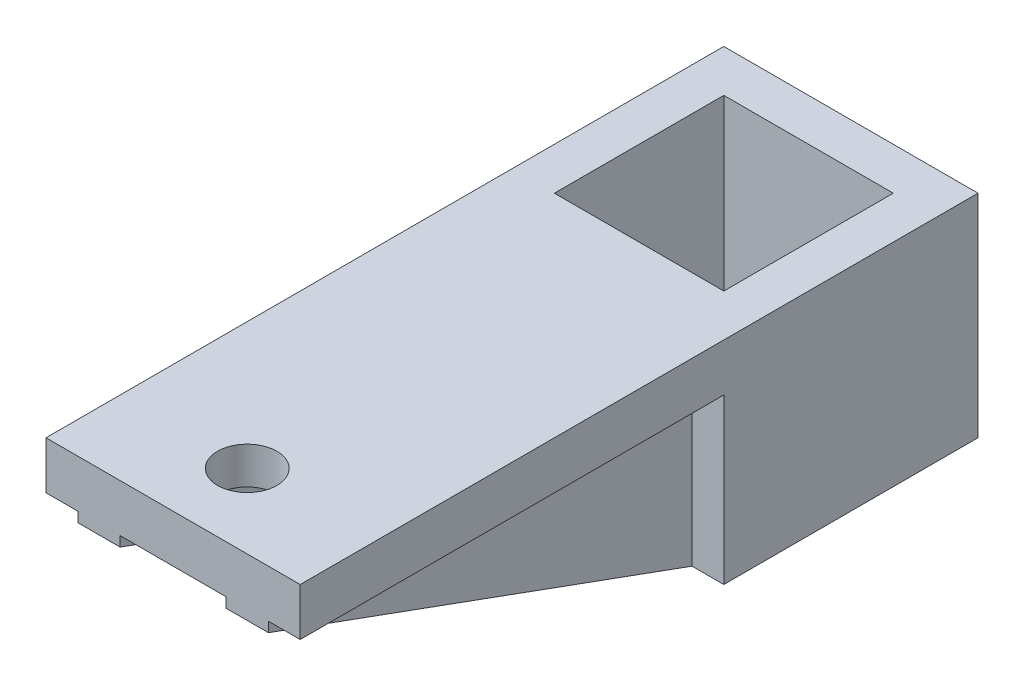
ISO-10303-21;
HEADER;
FILE_DESCRIPTION(('STEP AP214'),'2;1');
FILE_NAME('part.step','',(''),(''),'','','');
FILE_SCHEMA(('AUTOMOTIVE_DESIGN { 1 0 10303 214 1 1 1 1 }'));
ENDSEC;
DATA;
#1=APPLICATION_CONTEXT('core data for automotive mechanical design processes');
#2=APPLICATION_PROTOCOL_DEFINITION('international standard','automotive_design',2000,#1);
#3=PRODUCT_CONTEXT('',#1,'mechanical');
#4=PRODUCT('Part','Part','',(#3));
#5=PRODUCT_RELATED_PRODUCT_CATEGORY('part','',(#4));
#6=PRODUCT_DEFINITION_FORMATION('','',#4);
#7=PRODUCT_DEFINITION_CONTEXT('part definition',#1,'design');
#8=PRODUCT_DEFINITION('design','',#6,#7);
#9=PRODUCT_DEFINITION_SHAPE('','',#8);
#10=(LENGTH_UNIT() NAMED_UNIT(*) SI_UNIT(.MILLI.,.METRE.));
#11=(NAMED_UNIT(*) PLANE_ANGLE_UNIT() SI_UNIT($,.RADIAN.));
#12=(NAMED_UNIT(*) SI_UNIT($,.STERADIAN.) SOLID_ANGLE_UNIT());
#13=UNCERTAINTY_MEASURE_WITH_UNIT(LENGTH_MEASURE(1.E-05),#10,'distance_accuracy_value','');
#14=(GEOMETRIC_REPRESENTATION_CONTEXT(3) GLOBAL_UNCERTAINTY_ASSIGNED_CONTEXT((#13)) GLOBAL_UNIT_ASSIGNED_CONTEXT((#10,
#11,#12)) REPRESENTATION_CONTEXT('',''));
#15=CARTESIAN_POINT('',(0.,0.,0.));
#16=DIRECTION('',(0.,0.,1.));
#17=DIRECTION('',(1.,0.,0.));
#18=AXIS2_PLACEMENT_3D('',#15,#16,#17);
#19=CARTESIAN_POINT('',(-4.,15.5,44.));
#20=DIRECTION('',(0.,1.,0.));
#21=DIRECTION('',(0.,0.,1.));
#22=AXIS2_PLACEMENT_3D('',#19,#20,#21);
#23=PLANE('',#22);
#24=DIRECTION('',(0.,0.,-1.));
#25=VECTOR('',#24,1.);
#26=CARTESIAN_POINT('',(13.,15.5,43.9999999999996));
#27=LINE('',#26,#25);
#28=CARTESIAN_POINT('',(13.,15.5,37.));
#29=VERTEX_POINT('',#28);
#30=CARTESIAN_POINT('',(13.,15.5,4.));
#31=VERTEX_POINT('',#30);
#32=EDGE_CURVE('E180',#29,#31,#27,.T.);
#33=ORIENTED_EDGE('',*,*,#32,.F.);
#34=CARTESIAN_POINT('',(8.,15.5,37.));
#35=DIRECTION('',(0.,-1.,0.));
#36=DIRECTION('',(0.,0.,-1.));
#37=AXIS2_PLACEMENT_3D('',#34,#35,#36);
#38=CIRCLE('',#37,5.);
#39=CARTESIAN_POINT('',(3.,15.5,37.));
#40=VERTEX_POINT('',#39);
#41=EDGE_CURVE('E53',#40,#29,#38,.T.);
#42=ORIENTED_EDGE('',*,*,#41,.F.);
#43=DIRECTION('',(0.,0.,1.));
#44=VECTOR('',#43,1.);
#45=CARTESIAN_POINT('',(3.,15.5,43.9999999999996));
#46=LINE('',#45,#44);
#47=CARTESIAN_POINT('',(3.,15.5,4.));
#48=VERTEX_POINT('',#47);
#49=EDGE_CURVE('E178',#48,#40,#46,.T.);
#50=ORIENTED_EDGE('',*,*,#49,.F.);
#51=DIRECTION('',(1.,0.,0.));
#52=VECTOR('',#51,1.);
#53=CARTESIAN_POINT('',(-4.,15.5,4.));
#54=LINE('',#53,#52);
#55=EDGE_CURVE('E227',#48,#31,#54,.T.);
#56=ORIENTED_EDGE('',*,*,#55,.T.);
#57=EDGE_LOOP('',(#33,#42,#50,#56));
#58=FACE_BOUND('',#57,.T.);
#59=ADVANCED_FACE('F37',(#58),#23,.F.);
#60=CARTESIAN_POINT('',(8.,-24.5,37.));
#61=DIRECTION('',(0.,1.,0.));
#62=DIRECTION('',(0.,0.,1.));
#63=AXIS2_PLACEMENT_3D('',#60,#61,#62);
#64=CYLINDRICAL_SURFACE('',#63,2.8);
#65=CARTESIAN_POINT('',(8.,20.,37.));
#66=DIRECTION('',(0.,1.,0.));
#67=DIRECTION('',(0.,0.,1.));
#68=AXIS2_PLACEMENT_3D('',#65,#66,#67);
#69=CIRCLE('',#68,2.8);
#70=CARTESIAN_POINT('',(8.,20.,39.8));
#71=VERTEX_POINT('',#70);
#72=EDGE_CURVE('E206',#71,#71,#69,.F.);
#73=ORIENTED_EDGE('',*,*,#72,.F.);
#74=EDGE_LOOP('',(#73));
#75=FACE_BOUND('',#74,.T.);
#76=CARTESIAN_POINT('',(8.,16.5,37.));
#77=DIRECTION('',(0.,-1.,0.));
#78=DIRECTION('',(0.,0.,-1.));
#79=AXIS2_PLACEMENT_3D('',#76,#77,#78);
#80=CIRCLE('',#79,2.8);
#81=CARTESIAN_POINT('',(8.,16.5,34.2));
#82=VERTEX_POINT('',#81);
#83=EDGE_CURVE('E42',#82,#82,#80,.T.);
#84=ORIENTED_EDGE('',*,*,#83,.T.);
#85=EDGE_LOOP('',(#84));
#86=FACE_BOUND('',#85,.T.);
#87=ADVANCED_FACE('F390',(#75,#86),#64,.F.);
#88=CARTESIAN_POINT('',(-4.,20.,4.));
#89=DIRECTION('',(0.,0.,-1.));
#90=DIRECTION('',(-1.,0.,0.));
#91=AXIS2_PLACEMENT_3D('',#88,#89,#90);
#92=PLANE('',#91);
#93=DIRECTION('',(0.,1.,0.));
#94=VECTOR('',#93,1.);
#95=CARTESIAN_POINT('',(17.,-40.1995024844831,4.));
#96=LINE('',#95,#94);
#97=CARTESIAN_POINT('',(17.,0.,4.));
#98=VERTEX_POINT('',#97);
#99=CARTESIAN_POINT('',(17.,15.5,4.));
#100=VERTEX_POINT('',#99);
#101=EDGE_CURVE('E311',#98,#100,#96,.T.);
#102=ORIENTED_EDGE('',*,*,#101,.F.);
#103=DIRECTION('',(1.,0.,0.));
#104=VECTOR('',#103,1.);
#105=CARTESIAN_POINT('',(-4.,0.,4.));
#106=LINE('',#105,#104);
#107=CARTESIAN_POINT('',(20.,0.,4.));
#108=VERTEX_POINT('',#107);
#109=EDGE_CURVE('E264',#98,#108,#106,.T.);
#110=ORIENTED_EDGE('',*,*,#109,.T.);
#111=DIRECTION('',(0.,-1.,0.));
#112=VECTOR('',#111,1.);
#113=CARTESIAN_POINT('',(20.,20.,4.));
#114=LINE('',#113,#112);
#115=CARTESIAN_POINT('',(20.,15.5,4.));
#116=VERTEX_POINT('',#115);
#117=EDGE_CURVE('E290',#116,#108,#114,.T.);
#118=ORIENTED_EDGE('',*,*,#117,.F.);
#119=EDGE_CURVE('E209',#100,#116,#54,.T.);
#120=ORIENTED_EDGE('',*,*,#119,.F.);
#121=EDGE_LOOP('',(#102,#110,#118,#120));
#122=FACE_BOUND('',#121,.T.);
#123=ADVANCED_FACE('F317',(#122),#92,.F.);
#124=DIRECTION('',(0.,1.,0.));
#125=VECTOR('',#124,1.);
#126=CARTESIAN_POINT('',(13.,-40.1995024844831,4.));
#127=LINE('',#126,#125);
#128=CARTESIAN_POINT('',(13.,0.,4.));
#129=VERTEX_POINT('',#128);
#130=EDGE_CURVE('E319',#129,#31,#127,.T.);
#131=ORIENTED_EDGE('',*,*,#130,.T.);
#132=ORIENTED_EDGE('',*,*,#55,.F.);
#133=DIRECTION('',(0.,1.,0.));
#134=VECTOR('',#133,1.);
#135=CARTESIAN_POINT('',(3.,-40.1995024844831,4.));
#136=LINE('',#135,#134);
#137=CARTESIAN_POINT('',(3.,0.,4.));
#138=VERTEX_POINT('',#137);
#139=EDGE_CURVE('E194',#138,#48,#136,.T.);
#140=ORIENTED_EDGE('',*,*,#139,.F.);
#141=EDGE_CURVE('E277',#138,#129,#106,.T.);
#142=ORIENTED_EDGE('',*,*,#141,.T.);
#143=EDGE_LOOP('',(#131,#132,#140,#142));
#144=FACE_BOUND('',#143,.T.);
#145=ADVANCED_FACE('F382',(#144),#92,.F.);
#146=DIRECTION('',(0.,0.,1.));
#147=VECTOR('',#146,1.);
#148=CARTESIAN_POINT('',(17.,15.5,43.9999999999996));
#149=LINE('',#148,#147);
#150=CARTESIAN_POINT('',(17.,15.5,44.));
#151=VERTEX_POINT('',#150);
#152=EDGE_CURVE('E338',#100,#151,#149,.T.);
#153=ORIENTED_EDGE('',*,*,#152,.F.);
#154=ORIENTED_EDGE('',*,*,#119,.T.);
#155=DIRECTION('',(0.,0.,-1.));
#156=VECTOR('',#155,1.);
#157=CARTESIAN_POINT('',(20.,15.5,44.));
#158=LINE('',#157,#156);
#159=CARTESIAN_POINT('',(20.,15.5,44.));
#160=VERTEX_POINT('',#159);
#161=EDGE_CURVE('E224',#160,#116,#158,.T.);
#162=ORIENTED_EDGE('',*,*,#161,.F.);
#163=DIRECTION('',(1.,0.,0.));
#164=VECTOR('',#163,1.);
#165=CARTESIAN_POINT('',(-4.,15.5,44.));
#166=LINE('',#165,#164);
#167=EDGE_CURVE('E213',#151,#160,#166,.T.);
#168=ORIENTED_EDGE('',*,*,#167,.F.);
#169=EDGE_LOOP('',(#153,#154,#162,#168));
#170=FACE_BOUND('',#169,.T.);
#171=ADVANCED_FACE('F381',(#170),#23,.F.);
#172=CARTESIAN_POINT('',(3.,15.5,44.));
#173=VERTEX_POINT('',#172);
#174=EDGE_CURVE('E183',#40,#173,#46,.T.);
#175=ORIENTED_EDGE('',*,*,#174,.F.);
#176=EDGE_CURVE('E166',#29,#40,#38,.T.);
#177=ORIENTED_EDGE('',*,*,#176,.F.);
#178=CARTESIAN_POINT('',(13.,15.5,43.9999999999996));
#179=VERTEX_POINT('',#178);
#180=EDGE_CURVE('E341',#179,#29,#27,.T.);
#181=ORIENTED_EDGE('',*,*,#180,.F.);
#182=EDGE_CURVE('E186',#173,#179,#166,.T.);
#183=ORIENTED_EDGE('',*,*,#182,.F.);
#184=EDGE_LOOP('',(#175,#177,#181,#183));
#185=FACE_BOUND('',#184,.T.);
#186=ADVANCED_FACE('F184',(#185),#23,.F.);
#187=DIRECTION('',(0.,1.,0.));
#188=VECTOR('',#187,1.);
#189=CARTESIAN_POINT('',(-0.999999999999999,-40.1995024844831,4.));
#190=LINE('',#189,#188);
#191=CARTESIAN_POINT('',(-0.999999999999999,0.,4.));
#192=VERTEX_POINT('',#191);
#193=CARTESIAN_POINT('',(-0.999999999999999,15.5,4.));
#194=VERTEX_POINT('',#193);
#195=EDGE_CURVE('E203',#192,#194,#190,.T.);
#196=ORIENTED_EDGE('',*,*,#195,.T.);
#197=CARTESIAN_POINT('',(-4.,15.5,4.));
#198=VERTEX_POINT('',#197);
#199=EDGE_CURVE('E214',#198,#194,#54,.T.);
#200=ORIENTED_EDGE('',*,*,#199,.F.);
#201=DIRECTION('',(0.,-1.,0.));
#202=VECTOR('',#201,1.);
#203=CARTESIAN_POINT('',(-4.,20.,4.));
#204=LINE('',#203,#202);
#205=CARTESIAN_POINT('',(-4.,0.,4.));
#206=VERTEX_POINT('',#205);
#207=EDGE_CURVE('E272',#198,#206,#204,.T.);
#208=ORIENTED_EDGE('',*,*,#207,.T.);
#209=EDGE_CURVE('E273',#206,#192,#106,.T.);
#210=ORIENTED_EDGE('',*,*,#209,.T.);
#211=EDGE_LOOP('',(#196,#200,#208,#210));
#212=FACE_BOUND('',#211,.T.);
#213=ADVANCED_FACE('F351',(#212),#92,.F.);
#214=DIRECTION('',(0.,0.,-1.));
#215=VECTOR('',#214,1.);
#216=CARTESIAN_POINT('',(-0.999999999999999,15.5,43.9999999999996));
#217=LINE('',#216,#215);
#218=CARTESIAN_POINT('',(-0.999999999999999,15.5,43.9999999999996));
#219=VERTEX_POINT('',#218);
#220=EDGE_CURVE('E190',#219,#194,#217,.T.);
#221=ORIENTED_EDGE('',*,*,#220,.F.);
#222=CARTESIAN_POINT('',(-4.,15.5,44.));
#223=VERTEX_POINT('',#222);
#224=EDGE_CURVE('E215',#223,#219,#166,.T.);
#225=ORIENTED_EDGE('',*,*,#224,.F.);
#226=DIRECTION('',(0.,0.,-1.));
#227=VECTOR('',#226,1.);
#228=CARTESIAN_POINT('',(-4.,15.5,44.));
#229=LINE('',#228,#227);
#230=EDGE_CURVE('E230',#223,#198,#229,.T.);
#231=ORIENTED_EDGE('',*,*,#230,.T.);
#232=ORIENTED_EDGE('',*,*,#199,.T.);
#233=EDGE_LOOP('',(#221,#225,#231,#232));
#234=FACE_BOUND('',#233,.T.);
#235=ADVANCED_FACE('F355',(#234),#23,.F.);
#236=CARTESIAN_POINT('',(0.,20.,0.));
#237=DIRECTION('',(0.,1.,0.));
#238=DIRECTION('',(0.,0.,1.));
#239=AXIS2_PLACEMENT_3D('',#236,#237,#238);
#240=PLANE('',#239);
#241=ORIENTED_EDGE('',*,*,#72,.T.);
#242=EDGE_LOOP('',(#241));
#243=FACE_BOUND('',#242,.T.);
#244=DIRECTION('',(0.,0.,1.));
#245=VECTOR('',#244,1.);
#246=CARTESIAN_POINT('',(-4.,20.,4.));
#247=LINE('',#246,#245);
#248=CARTESIAN_POINT('',(-4.,20.,-20.));
#249=VERTEX_POINT('',#248);
#250=CARTESIAN_POINT('',(-4.,20.,44.));
#251=VERTEX_POINT('',#250);
#252=EDGE_CURVE('E270',#249,#251,#247,.T.);
#253=ORIENTED_EDGE('',*,*,#252,.T.);
#254=DIRECTION('',(-1.,0.,0.));
#255=VECTOR('',#254,1.);
#256=CARTESIAN_POINT('',(-4.,20.,44.));
#257=LINE('',#256,#255);
#258=CARTESIAN_POINT('',(20.,20.,44.));
#259=VERTEX_POINT('',#258);
#260=EDGE_CURVE('E221',#259,#251,#257,.T.);
#261=ORIENTED_EDGE('',*,*,#260,.F.);
#262=DIRECTION('',(0.,0.,-1.));
#263=VECTOR('',#262,1.);
#264=CARTESIAN_POINT('',(20.,20.,4.));
#265=LINE('',#264,#263);
#266=CARTESIAN_POINT('',(20.,20.,-20.));
#267=VERTEX_POINT('',#266);
#268=EDGE_CURVE('E265',#259,#267,#265,.T.);
#269=ORIENTED_EDGE('',*,*,#268,.T.);
#270=DIRECTION('',(-1.,0.,0.));
#271=VECTOR('',#270,1.);
#272=CARTESIAN_POINT('',(-4.,20.,-20.));
#273=LINE('',#272,#271);
#274=EDGE_CURVE('E267',#267,#249,#273,.T.);
#275=ORIENTED_EDGE('',*,*,#274,.T.);
#276=EDGE_LOOP('',(#253,#261,#269,#275));
#277=FACE_BOUND('',#276,.T.);
#278=DIRECTION('',(1.,0.,0.));
#279=VECTOR('',#278,1.);
#280=CARTESIAN_POINT('',(0.,20.,0.));
#281=LINE('',#280,#279);
#282=CARTESIAN_POINT('',(0.,20.,0.));
#283=VERTEX_POINT('',#282);
#284=CARTESIAN_POINT('',(16.,20.,0.));
#285=VERTEX_POINT('',#284);
#286=EDGE_CURVE('E236',#283,#285,#281,.T.);
#287=ORIENTED_EDGE('',*,*,#286,.F.);
#288=DIRECTION('',(0.,0.,1.));
#289=VECTOR('',#288,1.);
#290=CARTESIAN_POINT('',(0.,20.,0.));
#291=LINE('',#290,#289);
#292=CARTESIAN_POINT('',(0.,20.,-16.));
#293=VERTEX_POINT('',#292);
#294=EDGE_CURVE('E234',#293,#283,#291,.T.);
#295=ORIENTED_EDGE('',*,*,#294,.F.);
#296=DIRECTION('',(-1.,0.,0.));
#297=VECTOR('',#296,1.);
#298=CARTESIAN_POINT('',(0.,20.,-16.));
#299=LINE('',#298,#297);
#300=CARTESIAN_POINT('',(16.,20.,-16.));
#301=VERTEX_POINT('',#300);
#302=EDGE_CURVE('E242',#301,#293,#299,.T.);
#303=ORIENTED_EDGE('',*,*,#302,.F.);
#304=DIRECTION('',(0.,0.,-1.));
#305=VECTOR('',#304,1.);
#306=CARTESIAN_POINT('',(16.,20.,0.));
#307=LINE('',#306,#305);
#308=EDGE_CURVE('E239',#285,#301,#307,.T.);
#309=ORIENTED_EDGE('',*,*,#308,.F.);
#310=EDGE_LOOP('',(#287,#295,#303,#309));
#311=FACE_BOUND('',#310,.T.);
#312=ADVANCED_FACE('F370',(#243,#277,#311),#240,.T.);
#313=CARTESIAN_POINT('',(0.,0.,0.));
#314=DIRECTION('',(0.,1.,0.));
#315=DIRECTION('',(0.,0.,1.));
#316=AXIS2_PLACEMENT_3D('',#313,#314,#315);
#317=PLANE('',#316);
#318=ORIENTED_EDGE('',*,*,#141,.F.);
#319=DIRECTION('',(-1.,0.,0.));
#320=VECTOR('',#319,1.);
#321=CARTESIAN_POINT('',(-0.999999999999999,0.,3.99999999999923));
#322=LINE('',#321,#320);
#323=EDGE_CURVE('E302',#138,#192,#322,.T.);
#324=ORIENTED_EDGE('',*,*,#323,.T.);
#325=ORIENTED_EDGE('',*,*,#209,.F.);
#326=DIRECTION('',(0.,0.,1.));
#327=VECTOR('',#326,1.);
#328=CARTESIAN_POINT('',(-4.,0.,4.));
#329=LINE('',#328,#327);
#330=CARTESIAN_POINT('',(-4.,0.,-20.));
#331=VERTEX_POINT('',#330);
#332=EDGE_CURVE('E268',#331,#206,#329,.T.);
#333=ORIENTED_EDGE('',*,*,#332,.F.);
#334=DIRECTION('',(-1.,0.,0.));
#335=VECTOR('',#334,1.);
#336=CARTESIAN_POINT('',(-4.,0.,-20.));
#337=LINE('',#336,#335);
#338=CARTESIAN_POINT('',(20.,0.,-20.));
#339=VERTEX_POINT('',#338);
#340=EDGE_CURVE('E279',#339,#331,#337,.T.);
#341=ORIENTED_EDGE('',*,*,#340,.F.);
#342=DIRECTION('',(0.,0.,-1.));
#343=VECTOR('',#342,1.);
#344=CARTESIAN_POINT('',(20.,0.,4.));
#345=LINE('',#344,#343);
#346=EDGE_CURVE('E276',#108,#339,#345,.T.);
#347=ORIENTED_EDGE('',*,*,#346,.F.);
#348=ORIENTED_EDGE('',*,*,#109,.F.);
#349=DIRECTION('',(-1.,0.,0.));
#350=VECTOR('',#349,1.);
#351=CARTESIAN_POINT('',(13.,0.,3.99999999999923));
#352=LINE('',#351,#350);
#353=EDGE_CURVE('E300',#98,#129,#352,.T.);
#354=ORIENTED_EDGE('',*,*,#353,.T.);
#355=EDGE_LOOP('',(#318,#324,#325,#333,#341,#347,#348,#354));
#356=FACE_BOUND('',#355,.T.);
#357=DIRECTION('',(0.,0.,1.));
#358=VECTOR('',#357,1.);
#359=CARTESIAN_POINT('',(0.,0.,0.));
#360=LINE('',#359,#358);
#361=CARTESIAN_POINT('',(0.,0.,-16.));
#362=VERTEX_POINT('',#361);
#363=CARTESIAN_POINT('',(0.,0.,0.));
#364=VERTEX_POINT('',#363);
#365=EDGE_CURVE('E233',#362,#364,#360,.T.);
#366=ORIENTED_EDGE('',*,*,#365,.T.);
#367=DIRECTION('',(1.,0.,0.));
#368=VECTOR('',#367,1.);
#369=CARTESIAN_POINT('',(0.,0.,0.));
#370=LINE('',#369,#368);
#371=CARTESIAN_POINT('',(16.,0.,0.));
#372=VERTEX_POINT('',#371);
#373=EDGE_CURVE('E247',#364,#372,#370,.T.);
#374=ORIENTED_EDGE('',*,*,#373,.T.);
#375=DIRECTION('',(0.,0.,-1.));
#376=VECTOR('',#375,1.);
#377=CARTESIAN_POINT('',(16.,0.,0.));
#378=LINE('',#377,#376);
#379=CARTESIAN_POINT('',(16.,0.,-16.));
#380=VERTEX_POINT('',#379);
#381=EDGE_CURVE('E250',#372,#380,#378,.T.);
#382=ORIENTED_EDGE('',*,*,#381,.T.);
#383=DIRECTION('',(-1.,0.,0.));
#384=VECTOR('',#383,1.);
#385=CARTESIAN_POINT('',(0.,0.,-16.));
#386=LINE('',#385,#384);
#387=EDGE_CURVE('E237',#380,#362,#386,.T.);
#388=ORIENTED_EDGE('',*,*,#387,.T.);
#389=EDGE_LOOP('',(#366,#374,#382,#388));
#390=FACE_BOUND('',#389,.T.);
#391=ADVANCED_FACE('F324',(#356,#390),#317,.F.);
#392=CARTESIAN_POINT('',(20.,20.,4.));
#393=DIRECTION('',(-1.,0.,0.));
#394=DIRECTION('',(0.,0.,1.));
#395=AXIS2_PLACEMENT_3D('',#392,#393,#394);
#396=PLANE('',#395);
#397=ORIENTED_EDGE('',*,*,#346,.T.);
#398=DIRECTION('',(0.,-1.,0.));
#399=VECTOR('',#398,1.);
#400=CARTESIAN_POINT('',(20.,20.,-20.));
#401=LINE('',#400,#399);
#402=EDGE_CURVE('E287',#267,#339,#401,.T.);
#403=ORIENTED_EDGE('',*,*,#402,.F.);
#404=ORIENTED_EDGE('',*,*,#268,.F.);
#405=DIRECTION('',(0.,1.,0.));
#406=VECTOR('',#405,1.);
#407=CARTESIAN_POINT('',(20.,20.,44.));
#408=LINE('',#407,#406);
#409=EDGE_CURVE('E218',#160,#259,#408,.T.);
#410=ORIENTED_EDGE('',*,*,#409,.F.);
#411=ORIENTED_EDGE('',*,*,#161,.T.);
#412=ORIENTED_EDGE('',*,*,#117,.T.);
#413=EDGE_LOOP('',(#397,#403,#404,#410,#411,#412));
#414=FACE_BOUND('',#413,.T.);
#415=ADVANCED_FACE('F377',(#414),#396,.F.);
#416=CARTESIAN_POINT('',(-4.,20.,-20.));
#417=DIRECTION('',(0.,0.,1.));
#418=DIRECTION('',(1.,0.,0.));
#419=AXIS2_PLACEMENT_3D('',#416,#417,#418);
#420=PLANE('',#419);
#421=ORIENTED_EDGE('',*,*,#340,.T.);
#422=DIRECTION('',(0.,-1.,0.));
#423=VECTOR('',#422,1.);
#424=CARTESIAN_POINT('',(-4.,20.,-20.));
#425=LINE('',#424,#423);
#426=EDGE_CURVE('E284',#249,#331,#425,.T.);
#427=ORIENTED_EDGE('',*,*,#426,.F.);
#428=ORIENTED_EDGE('',*,*,#274,.F.);
#429=ORIENTED_EDGE('',*,*,#402,.T.);
#430=EDGE_LOOP('',(#421,#427,#428,#429));
#431=FACE_BOUND('',#430,.T.);
#432=ADVANCED_FACE('F375',(#431),#420,.F.);
#433=CARTESIAN_POINT('',(-4.,20.,4.));
#434=DIRECTION('',(1.,0.,0.));
#435=DIRECTION('',(0.,0.,-1.));
#436=AXIS2_PLACEMENT_3D('',#433,#434,#435);
#437=PLANE('',#436);
#438=ORIENTED_EDGE('',*,*,#332,.T.);
#439=ORIENTED_EDGE('',*,*,#207,.F.);
#440=ORIENTED_EDGE('',*,*,#230,.F.);
#441=DIRECTION('',(0.,-1.,0.));
#442=VECTOR('',#441,1.);
#443=CARTESIAN_POINT('',(-4.,20.,44.));
#444=LINE('',#443,#442);
#445=EDGE_CURVE('E210',#251,#223,#444,.T.);
#446=ORIENTED_EDGE('',*,*,#445,.F.);
#447=ORIENTED_EDGE('',*,*,#252,.F.);
#448=ORIENTED_EDGE('',*,*,#426,.T.);
#449=EDGE_LOOP('',(#438,#439,#440,#446,#447,#448));
#450=FACE_BOUND('',#449,.T.);
#451=ADVANCED_FACE('F359',(#450),#437,.F.);
#452=CARTESIAN_POINT('',(0.,20.,0.));
#453=DIRECTION('',(1.,0.,0.));
#454=DIRECTION('',(0.,0.,-1.));
#455=AXIS2_PLACEMENT_3D('',#452,#453,#454);
#456=PLANE('',#455);
#457=ORIENTED_EDGE('',*,*,#365,.F.);
#458=DIRECTION('',(0.,-1.,0.));
#459=VECTOR('',#458,1.);
#460=CARTESIAN_POINT('',(0.,20.,-16.));
#461=LINE('',#460,#459);
#462=EDGE_CURVE('E244',#293,#362,#461,.T.);
#463=ORIENTED_EDGE('',*,*,#462,.F.);
#464=ORIENTED_EDGE('',*,*,#294,.T.);
#465=DIRECTION('',(0.,-1.,0.));
#466=VECTOR('',#465,1.);
#467=CARTESIAN_POINT('',(0.,20.,0.));
#468=LINE('',#467,#466);
#469=EDGE_CURVE('E261',#283,#364,#468,.T.);
#470=ORIENTED_EDGE('',*,*,#469,.T.);
#471=EDGE_LOOP('',(#457,#463,#464,#470));
#472=FACE_BOUND('',#471,.T.);
#473=ADVANCED_FACE('F415',(#472),#456,.T.);
#474=CARTESIAN_POINT('',(0.,20.,0.));
#475=DIRECTION('',(0.,0.,-1.));
#476=DIRECTION('',(-1.,0.,0.));
#477=AXIS2_PLACEMENT_3D('',#474,#475,#476);
#478=PLANE('',#477);
#479=ORIENTED_EDGE('',*,*,#373,.F.);
#480=ORIENTED_EDGE('',*,*,#469,.F.);
#481=ORIENTED_EDGE('',*,*,#286,.T.);
#482=DIRECTION('',(0.,-1.,0.));
#483=VECTOR('',#482,1.);
#484=CARTESIAN_POINT('',(16.,20.,0.));
#485=LINE('',#484,#483);
#486=EDGE_CURVE('E259',#285,#372,#485,.T.);
#487=ORIENTED_EDGE('',*,*,#486,.T.);
#488=EDGE_LOOP('',(#479,#480,#481,#487));
#489=FACE_BOUND('',#488,.T.);
#490=ADVANCED_FACE('F441',(#489),#478,.T.);
#491=CARTESIAN_POINT('',(16.,20.,0.));
#492=DIRECTION('',(-1.,0.,0.));
#493=DIRECTION('',(0.,0.,1.));
#494=AXIS2_PLACEMENT_3D('',#491,#492,#493);
#495=PLANE('',#494);
#496=ORIENTED_EDGE('',*,*,#381,.F.);
#497=ORIENTED_EDGE('',*,*,#486,.F.);
#498=ORIENTED_EDGE('',*,*,#308,.T.);
#499=DIRECTION('',(0.,-1.,0.));
#500=VECTOR('',#499,1.);
#501=CARTESIAN_POINT('',(16.,20.,-16.));
#502=LINE('',#501,#500);
#503=EDGE_CURVE('E257',#301,#380,#502,.T.);
#504=ORIENTED_EDGE('',*,*,#503,.T.);
#505=EDGE_LOOP('',(#496,#497,#498,#504));
#506=FACE_BOUND('',#505,.T.);
#507=ADVANCED_FACE('F448',(#506),#495,.T.);
#508=CARTESIAN_POINT('',(0.,20.,-16.));
#509=DIRECTION('',(0.,0.,1.));
#510=DIRECTION('',(1.,0.,0.));
#511=AXIS2_PLACEMENT_3D('',#508,#509,#510);
#512=PLANE('',#511);
#513=ORIENTED_EDGE('',*,*,#387,.F.);
#514=ORIENTED_EDGE('',*,*,#503,.F.);
#515=ORIENTED_EDGE('',*,*,#302,.T.);
#516=ORIENTED_EDGE('',*,*,#462,.T.);
#517=EDGE_LOOP('',(#513,#514,#515,#516));
#518=FACE_BOUND('',#517,.T.);
#519=ADVANCED_FACE('F455',(#518),#512,.T.);
#520=CARTESIAN_POINT('',(0.,0.,44.));
#521=DIRECTION('',(0.,0.,1.));
#522=DIRECTION('',(1.,0.,0.));
#523=AXIS2_PLACEMENT_3D('',#520,#521,#522);
#524=PLANE('',#523);
#525=DIRECTION('',(0.,1.,0.));
#526=VECTOR('',#525,1.);
#527=CARTESIAN_POINT('',(-0.999999999999999,-40.1995024844831,43.9999999999996));
#528=LINE('',#527,#526);
#529=CARTESIAN_POINT('',(-0.999999999999999,14.5588093706483,43.9999999999996));
#530=VERTEX_POINT('',#529);
#531=EDGE_CURVE('E195',#530,#219,#528,.T.);
#532=ORIENTED_EDGE('',*,*,#531,.F.);
#533=DIRECTION('',(1.,0.,0.));
#534=VECTOR('',#533,1.);
#535=CARTESIAN_POINT('',(3.,14.5588093706483,44.));
#536=LINE('',#535,#534);
#537=CARTESIAN_POINT('',(3.,14.5588093706483,43.9999999999996));
#538=VERTEX_POINT('',#537);
#539=EDGE_CURVE('E295',#530,#538,#536,.T.);
#540=ORIENTED_EDGE('',*,*,#539,.T.);
#541=DIRECTION('',(0.,1.,0.));
#542=VECTOR('',#541,1.);
#543=CARTESIAN_POINT('',(3.,-40.1995024844831,43.9999999999996));
#544=LINE('',#543,#542);
#545=EDGE_CURVE('E196',#538,#173,#544,.T.);
#546=ORIENTED_EDGE('',*,*,#545,.T.);
#547=ORIENTED_EDGE('',*,*,#182,.T.);
#548=DIRECTION('',(0.,1.,0.));
#549=VECTOR('',#548,1.);
#550=CARTESIAN_POINT('',(13.,-40.1995024844831,43.9999999999996));
#551=LINE('',#550,#549);
#552=CARTESIAN_POINT('',(13.,14.5588093706483,43.9999999999996));
#553=VERTEX_POINT('',#552);
#554=EDGE_CURVE('E332',#553,#179,#551,.T.);
#555=ORIENTED_EDGE('',*,*,#554,.F.);
#556=DIRECTION('',(1.,0.,0.));
#557=VECTOR('',#556,1.);
#558=CARTESIAN_POINT('',(17.,14.5588093706483,44.));
#559=LINE('',#558,#557);
#560=CARTESIAN_POINT('',(17.,14.5588093706483,43.9999999999996));
#561=VERTEX_POINT('',#560);
#562=EDGE_CURVE('E293',#553,#561,#559,.T.);
#563=ORIENTED_EDGE('',*,*,#562,.T.);
#564=DIRECTION('',(0.,1.,0.));
#565=VECTOR('',#564,1.);
#566=CARTESIAN_POINT('',(17.,-40.1995024844831,43.9999999999996));
#567=LINE('',#566,#565);
#568=EDGE_CURVE('E313',#561,#151,#567,.T.);
#569=ORIENTED_EDGE('',*,*,#568,.T.);
#570=ORIENTED_EDGE('',*,*,#167,.T.);
#571=ORIENTED_EDGE('',*,*,#409,.T.);
#572=ORIENTED_EDGE('',*,*,#260,.T.);
#573=ORIENTED_EDGE('',*,*,#445,.T.);
#574=ORIENTED_EDGE('',*,*,#224,.T.);
#575=EDGE_LOOP('',(#532,#540,#546,#547,#555,#563,#569,#570,#571,#572,#573,#574));
#576=FACE_BOUND('',#575,.T.);
#577=ADVANCED_FACE('F337',(#576),#524,.T.);
#578=CARTESIAN_POINT('',(3.,-40.1995024844831,43.9999999999996));
#579=DIRECTION('',(-1.,0.,0.));
#580=DIRECTION('',(0.,0.,1.));
#581=AXIS2_PLACEMENT_3D('',#578,#579,#580);
#582=PLANE('',#581);
#583=ORIENTED_EDGE('',*,*,#545,.F.);
#584=DIRECTION('',(0.,-0.342020143325666,-0.939692620785909));
#585=VECTOR('',#584,1.);
#586=CARTESIAN_POINT('',(3.,14.5588093706483,44.));
#587=LINE('',#586,#585);
#588=EDGE_CURVE('E298',#538,#138,#587,.T.);
#589=ORIENTED_EDGE('',*,*,#588,.T.);
#590=ORIENTED_EDGE('',*,*,#139,.T.);
#591=ORIENTED_EDGE('',*,*,#49,.T.);
#592=ORIENTED_EDGE('',*,*,#174,.T.);
#593=EDGE_LOOP('',(#583,#589,#590,#591,#592));
#594=FACE_BOUND('',#593,.T.);
#595=ADVANCED_FACE('F192',(#594),#582,.F.);
#596=CARTESIAN_POINT('',(-0.999999999999999,-40.1995024844831,43.9999999999996));
#597=DIRECTION('',(1.,0.,0.));
#598=DIRECTION('',(0.,0.,-1.));
#599=AXIS2_PLACEMENT_3D('',#596,#597,#598);
#600=PLANE('',#599);
#601=ORIENTED_EDGE('',*,*,#195,.F.);
#602=DIRECTION('',(0.,0.342020143325666,0.939692620785909));
#603=VECTOR('',#602,1.);
#604=CARTESIAN_POINT('',(-0.999999999999999,14.5588093706483,44.));
#605=LINE('',#604,#603);
#606=EDGE_CURVE('E304',#192,#530,#605,.T.);
#607=ORIENTED_EDGE('',*,*,#606,.T.);
#608=ORIENTED_EDGE('',*,*,#531,.T.);
#609=ORIENTED_EDGE('',*,*,#220,.T.);
#610=EDGE_LOOP('',(#601,#607,#608,#609));
#611=FACE_BOUND('',#610,.T.);
#612=ADVANCED_FACE('F348',(#611),#600,.F.);
#613=CARTESIAN_POINT('',(17.,-40.1995024844831,43.9999999999996));
#614=DIRECTION('',(-1.,0.,0.));
#615=DIRECTION('',(0.,0.,1.));
#616=AXIS2_PLACEMENT_3D('',#613,#614,#615);
#617=PLANE('',#616);
#618=ORIENTED_EDGE('',*,*,#568,.F.);
#619=DIRECTION('',(0.,-0.342020143325666,-0.939692620785909));
#620=VECTOR('',#619,1.);
#621=CARTESIAN_POINT('',(17.,14.5588093706483,44.));
#622=LINE('',#621,#620);
#623=EDGE_CURVE('E47',#561,#98,#622,.T.);
#624=ORIENTED_EDGE('',*,*,#623,.T.);
#625=ORIENTED_EDGE('',*,*,#101,.T.);
#626=ORIENTED_EDGE('',*,*,#152,.T.);
#627=EDGE_LOOP('',(#618,#624,#625,#626));
#628=FACE_BOUND('',#627,.T.);
#629=ADVANCED_FACE('F309',(#628),#617,.F.);
#630=CARTESIAN_POINT('',(13.,-40.1995024844831,43.9999999999996));
#631=DIRECTION('',(1.,0.,0.));
#632=DIRECTION('',(0.,0.,-1.));
#633=AXIS2_PLACEMENT_3D('',#630,#631,#632);
#634=PLANE('',#633);
#635=ORIENTED_EDGE('',*,*,#130,.F.);
#636=DIRECTION('',(0.,0.342020143325666,0.939692620785909));
#637=VECTOR('',#636,1.);
#638=CARTESIAN_POINT('',(13.,14.5588093706483,44.));
#639=LINE('',#638,#637);
#640=EDGE_CURVE('E11',#129,#553,#639,.T.);
#641=ORIENTED_EDGE('',*,*,#640,.T.);
#642=ORIENTED_EDGE('',*,*,#554,.T.);
#643=ORIENTED_EDGE('',*,*,#180,.T.);
#644=ORIENTED_EDGE('',*,*,#32,.T.);
#645=EDGE_LOOP('',(#635,#641,#642,#643,#644));
#646=FACE_BOUND('',#645,.T.);
#647=ADVANCED_FACE('F331',(#646),#634,.F.);
#648=CARTESIAN_POINT('',(0.,14.5588093706483,44.));
#649=DIRECTION('',(0.,-0.939692620785909,0.342020143325666));
#650=DIRECTION('',(-1.,0.,0.));
#651=AXIS2_PLACEMENT_3D('',#648,#649,#650);
#652=PLANE('',#651);
#653=ORIENTED_EDGE('',*,*,#606,.F.);
#654=ORIENTED_EDGE('',*,*,#323,.F.);
#655=ORIENTED_EDGE('',*,*,#588,.F.);
#656=ORIENTED_EDGE('',*,*,#539,.F.);
#657=EDGE_LOOP('',(#653,#654,#655,#656));
#658=FACE_BOUND('',#657,.T.);
#659=ADVANCED_FACE('F365',(#658),#652,.T.);
#660=CARTESIAN_POINT('',(0.,14.5588093706483,44.));
#661=DIRECTION('',(0.,-0.939692620785909,0.342020143325666));
#662=DIRECTION('',(-1.,0.,0.));
#663=AXIS2_PLACEMENT_3D('',#660,#661,#662);
#664=PLANE('',#663);
#665=ORIENTED_EDGE('',*,*,#640,.F.);
#666=ORIENTED_EDGE('',*,*,#353,.F.);
#667=ORIENTED_EDGE('',*,*,#623,.F.);
#668=ORIENTED_EDGE('',*,*,#562,.F.);
#669=EDGE_LOOP('',(#665,#666,#667,#668));
#670=FACE_BOUND('',#669,.T.);
#671=ADVANCED_FACE('F40',(#670),#664,.T.);
#672=CARTESIAN_POINT('',(8.,16.5,37.));
#673=DIRECTION('',(0.,-1.,0.));
#674=DIRECTION('',(0.,0.,-1.));
#675=AXIS2_PLACEMENT_3D('',#672,#673,#674);
#676=CYLINDRICAL_SURFACE('',#675,5.);
#677=CARTESIAN_POINT('',(8.,16.5,37.));
#678=DIRECTION('',(0.,-1.,0.));
#679=DIRECTION('',(0.,0.,-1.));
#680=AXIS2_PLACEMENT_3D('',#677,#678,#679);
#681=CIRCLE('',#680,5.);
#682=CARTESIAN_POINT('',(8.,16.5,32.));
#683=VERTEX_POINT('',#682);
#684=EDGE_CURVE('E172',#683,#683,#681,.T.);
#685=ORIENTED_EDGE('',*,*,#684,.F.);
#686=EDGE_LOOP('',(#685));
#687=FACE_BOUND('',#686,.T.);
#688=ORIENTED_EDGE('',*,*,#176,.T.);
#689=ORIENTED_EDGE('',*,*,#41,.T.);
#690=EDGE_LOOP('',(#688,#689));
#691=FACE_BOUND('',#690,.T.);
#692=ADVANCED_FACE('F167',(#687,#691),#676,.F.);
#693=CARTESIAN_POINT('',(8.,16.5,37.));
#694=DIRECTION('',(0.,-1.,0.));
#695=DIRECTION('',(0.,0.,-1.));
#696=AXIS2_PLACEMENT_3D('',#693,#694,#695);
#697=PLANE('',#696);
#698=ORIENTED_EDGE('',*,*,#83,.F.);
#699=EDGE_LOOP('',(#698));
#700=FACE_BOUND('',#699,.T.);
#701=ORIENTED_EDGE('',*,*,#684,.T.);
#702=EDGE_LOOP('',(#701));
#703=FACE_BOUND('',#702,.T.);
#704=ADVANCED_FACE('F507',(#700,#703),#697,.T.);
#705=CLOSED_SHELL('',(#59,#87,#123,#145,#171,#186,#213,#235,#312,#391,#415,#432,#451,#473,#490,
#507,#519,#577,#595,#612,#629,#647,#659,#671,#692,#704));
#706=MANIFOLD_SOLID_BREP('B2',#705);
#707=ADVANCED_BREP_SHAPE_REPRESENTATION('',(#18,#706),#14);
#708=SHAPE_DEFINITION_REPRESENTATION(#9,#707);
ENDSEC;
END-ISO-10303-21;
